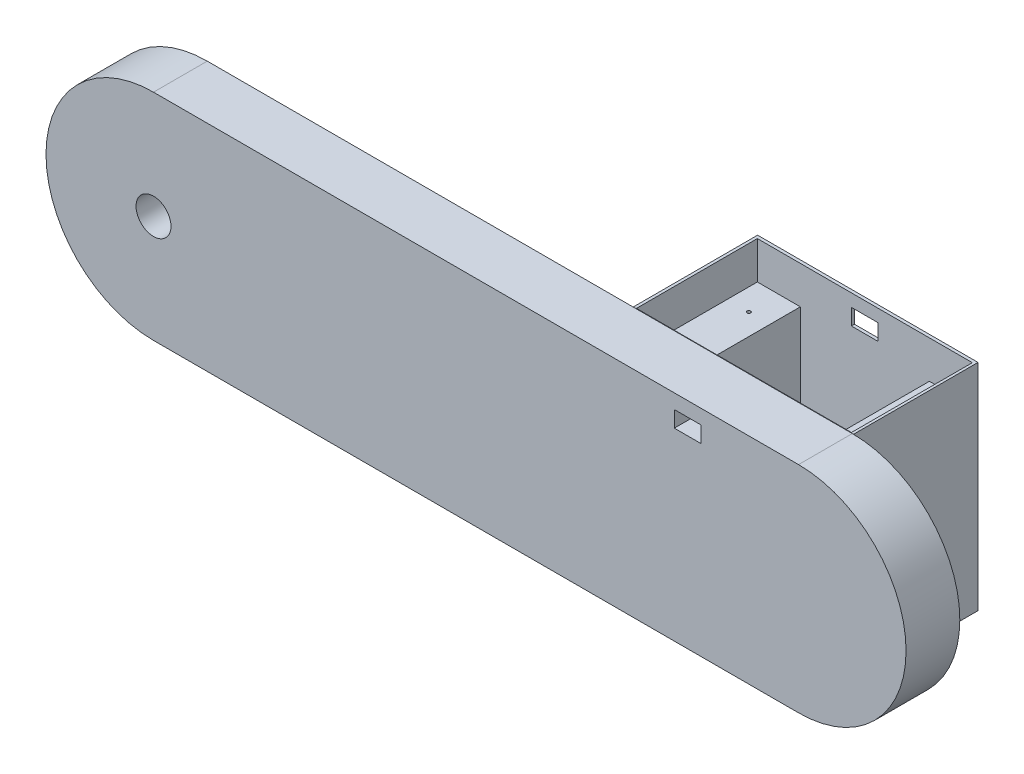
ISO-10303-21;
HEADER;
FILE_DESCRIPTION(('STEP AP214'),'2;1');
FILE_NAME('part.step','',(''),(''),'','','');
FILE_SCHEMA(('AUTOMOTIVE_DESIGN { 1 0 10303 214 1 1 1 1 }'));
ENDSEC;
DATA;
#1=APPLICATION_CONTEXT('core data for automotive mechanical design processes');
#2=APPLICATION_PROTOCOL_DEFINITION('international standard','automotive_design',2000,#1);
#3=PRODUCT_CONTEXT('',#1,'mechanical');
#4=PRODUCT('Part','Part','',(#3));
#5=PRODUCT_RELATED_PRODUCT_CATEGORY('part','',(#4));
#6=PRODUCT_DEFINITION_FORMATION('','',#4);
#7=PRODUCT_DEFINITION_CONTEXT('part definition',#1,'design');
#8=PRODUCT_DEFINITION('design','',#6,#7);
#9=PRODUCT_DEFINITION_SHAPE('','',#8);
#10=(LENGTH_UNIT() NAMED_UNIT(*) SI_UNIT(.MILLI.,.METRE.));
#11=(NAMED_UNIT(*) PLANE_ANGLE_UNIT() SI_UNIT($,.RADIAN.));
#12=(NAMED_UNIT(*) SI_UNIT($,.STERADIAN.) SOLID_ANGLE_UNIT());
#13=UNCERTAINTY_MEASURE_WITH_UNIT(LENGTH_MEASURE(1.E-05),#10,'distance_accuracy_value','');
#14=(GEOMETRIC_REPRESENTATION_CONTEXT(3) GLOBAL_UNCERTAINTY_ASSIGNED_CONTEXT((#13)) GLOBAL_UNIT_ASSIGNED_CONTEXT((#10,
#11,#12)) REPRESENTATION_CONTEXT('',''));
#15=CARTESIAN_POINT('',(0.,0.,0.));
#16=DIRECTION('',(0.,0.,1.));
#17=DIRECTION('',(1.,0.,0.));
#18=AXIS2_PLACEMENT_3D('',#15,#16,#17);
#19=CARTESIAN_POINT('',(9.4653166633379,-20.799662349746,-22.9318291217864));
#20=DIRECTION('',(0.,0.,-1.));
#21=DIRECTION('',(-1.,0.,0.));
#22=AXIS2_PLACEMENT_3D('',#19,#20,#21);
#23=PLANE('',#22);
#24=DIRECTION('',(-1.,0.,0.));
#25=VECTOR('',#24,1.);
#26=CARTESIAN_POINT('',(9.4653166633379,12.8589922089124,-22.9318291217864));
#27=LINE('',#26,#25);
#28=CARTESIAN_POINT('',(31.9407170008609,12.8589922089124,-22.9318291217864));
#29=VERTEX_POINT('',#28);
#30=CARTESIAN_POINT('',(26.9483388823597,12.8589922089124,-22.9318291217864));
#31=VERTEX_POINT('',#30);
#32=EDGE_CURVE('E261',#29,#31,#27,.T.);
#33=ORIENTED_EDGE('',*,*,#32,.T.);
#34=DIRECTION('',(0.,1.,0.));
#35=VECTOR('',#34,1.);
#36=CARTESIAN_POINT('',(26.9483388823597,-20.799662349746,-22.9318291217864));
#37=LINE('',#36,#35);
#38=CARTESIAN_POINT('',(26.9483388823597,15.8625567275374,-22.9318291217864));
#39=VERTEX_POINT('',#38);
#40=EDGE_CURVE('E269',#31,#39,#37,.T.);
#41=ORIENTED_EDGE('',*,*,#40,.T.);
#42=DIRECTION('',(1.,0.,0.));
#43=VECTOR('',#42,1.);
#44=CARTESIAN_POINT('',(9.4653166633379,15.8625567275374,-22.9318291217864));
#45=LINE('',#44,#43);
#46=CARTESIAN_POINT('',(31.9407170008609,15.8625567275374,-22.9318291217864));
#47=VERTEX_POINT('',#46);
#48=EDGE_CURVE('E247',#39,#47,#45,.T.);
#49=ORIENTED_EDGE('',*,*,#48,.T.);
#50=DIRECTION('',(0.,-1.,0.));
#51=VECTOR('',#50,1.);
#52=CARTESIAN_POINT('',(31.9407170008609,-20.799662349746,-22.9318291217864));
#53=LINE('',#52,#51);
#54=EDGE_CURVE('E213',#47,#29,#53,.T.);
#55=ORIENTED_EDGE('',*,*,#54,.T.);
#56=EDGE_LOOP('',(#33,#41,#49,#55));
#57=FACE_BOUND('',#56,.T.);
#58=DIRECTION('',(0.,-1.,0.));
#59=VECTOR('',#58,1.);
#60=CARTESIAN_POINT('',(17.4653166633379,11.200337650254,-22.9318291217864));
#61=LINE('',#60,#59);
#62=CARTESIAN_POINT('',(17.4653166633379,11.200337650254,-22.9318291217864));
#63=VERTEX_POINT('',#62);
#64=CARTESIAN_POINT('',(17.4653166633379,-20.799662349746,-22.9318291217864));
#65=VERTEX_POINT('',#64);
#66=EDGE_CURVE('E306',#63,#65,#61,.T.);
#67=ORIENTED_EDGE('',*,*,#66,.T.);
#68=DIRECTION('',(-1.,0.,0.));
#69=VECTOR('',#68,1.);
#70=CARTESIAN_POINT('',(9.4653166633379,-20.799662349746,-22.9318291217864));
#71=LINE('',#70,#69);
#72=CARTESIAN_POINT('',(41.4653166633379,-20.799662349746,-22.9318291217864));
#73=VERTEX_POINT('',#72);
#74=EDGE_CURVE('E330',#73,#65,#71,.T.);
#75=ORIENTED_EDGE('',*,*,#74,.F.);
#76=DIRECTION('',(0.,-1.,0.));
#77=VECTOR('',#76,1.);
#78=CARTESIAN_POINT('',(41.4653166633379,11.200337650254,-22.9318291217864));
#79=LINE('',#78,#77);
#80=CARTESIAN_POINT('',(41.4653166633379,11.200337650254,-22.9318291217864));
#81=VERTEX_POINT('',#80);
#82=EDGE_CURVE('E294',#81,#73,#79,.T.);
#83=ORIENTED_EDGE('',*,*,#82,.F.);
#84=DIRECTION('',(-1.,0.,0.));
#85=VECTOR('',#84,1.);
#86=CARTESIAN_POINT('',(49.4653166633379,11.200337650254,-22.9318291217864));
#87=LINE('',#86,#85);
#88=CARTESIAN_POINT('',(49.4653166633379,11.200337650254,-22.9318291217864));
#89=VERTEX_POINT('',#88);
#90=EDGE_CURVE('E324',#89,#81,#87,.T.);
#91=ORIENTED_EDGE('',*,*,#90,.F.);
#92=DIRECTION('',(0.,1.,0.));
#93=VECTOR('',#92,1.);
#94=CARTESIAN_POINT('',(49.4653166633379,-20.799662349746,-22.9318291217864));
#95=LINE('',#94,#93);
#96=CARTESIAN_POINT('',(49.4653166633379,18.200337650254,-22.9318291217864));
#97=VERTEX_POINT('',#96);
#98=EDGE_CURVE('E348',#89,#97,#95,.T.);
#99=ORIENTED_EDGE('',*,*,#98,.T.);
#100=DIRECTION('',(-1.,0.,0.));
#101=VECTOR('',#100,1.);
#102=CARTESIAN_POINT('',(9.4653166633379,18.200337650254,-22.9318291217864));
#103=LINE('',#102,#101);
#104=CARTESIAN_POINT('',(9.4653166633379,18.200337650254,-22.9318291217864));
#105=VERTEX_POINT('',#104);
#106=EDGE_CURVE('E331',#97,#105,#103,.T.);
#107=ORIENTED_EDGE('',*,*,#106,.T.);
#108=DIRECTION('',(0.,1.,0.));
#109=VECTOR('',#108,1.);
#110=CARTESIAN_POINT('',(9.4653166633379,-20.799662349746,-22.9318291217864));
#111=LINE('',#110,#109);
#112=CARTESIAN_POINT('',(9.4653166633379,11.200337650254,-22.9318291217864));
#113=VERTEX_POINT('',#112);
#114=EDGE_CURVE('E345',#113,#105,#111,.T.);
#115=ORIENTED_EDGE('',*,*,#114,.F.);
#116=DIRECTION('',(-1.,0.,0.));
#117=VECTOR('',#116,1.);
#118=CARTESIAN_POINT('',(9.4653166633379,11.200337650254,-22.9318291217864));
#119=LINE('',#118,#117);
#120=EDGE_CURVE('E304',#63,#113,#119,.T.);
#121=ORIENTED_EDGE('',*,*,#120,.F.);
#122=EDGE_LOOP('',(#67,#75,#83,#91,#99,#107,#115,#121));
#123=FACE_BOUND('',#122,.T.);
#124=ADVANCED_FACE('F39',(#57,#123),#23,.F.);
#125=CARTESIAN_POINT('',(49.4653166633379,-20.799662349746,-22.9318291217864));
#126=DIRECTION('',(1.,0.,0.));
#127=DIRECTION('',(0.,0.,-1.));
#128=AXIS2_PLACEMENT_3D('',#125,#126,#127);
#129=PLANE('',#128);
#130=DIRECTION('',(0.,0.,-1.));
#131=VECTOR('',#130,1.);
#132=CARTESIAN_POINT('',(49.4653166633379,11.200337650254,-22.9318291217864));
#133=LINE('',#132,#131);
#134=CARTESIAN_POINT('',(49.4653166633379,11.200337650254,-0.431829121786357));
#135=VERTEX_POINT('',#134);
#136=EDGE_CURVE('E320',#135,#89,#133,.T.);
#137=ORIENTED_EDGE('',*,*,#136,.F.);
#138=DIRECTION('',(0.,1.,0.));
#139=VECTOR('',#138,1.);
#140=CARTESIAN_POINT('',(49.4653166633379,-20.799662349746,-0.431829121786357));
#141=LINE('',#140,#139);
#142=CARTESIAN_POINT('',(49.4653166633379,18.200337650254,-0.431829121786357));
#143=VERTEX_POINT('',#142);
#144=EDGE_CURVE('E350',#135,#143,#141,.T.);
#145=ORIENTED_EDGE('',*,*,#144,.T.);
#146=DIRECTION('',(0.,0.,-1.));
#147=VECTOR('',#146,1.);
#148=CARTESIAN_POINT('',(49.4653166633379,18.200337650254,-22.9318291217864));
#149=LINE('',#148,#147);
#150=EDGE_CURVE('E340',#143,#97,#149,.T.);
#151=ORIENTED_EDGE('',*,*,#150,.T.);
#152=ORIENTED_EDGE('',*,*,#98,.F.);
#153=EDGE_LOOP('',(#137,#145,#151,#152));
#154=FACE_BOUND('',#153,.T.);
#155=ADVANCED_FACE('F476',(#154),#129,.F.);
#156=CARTESIAN_POINT('',(9.4653166633379,-20.799662349746,-0.431829121786357));
#157=DIRECTION('',(0.,0.,1.));
#158=DIRECTION('',(1.,0.,0.));
#159=AXIS2_PLACEMENT_3D('',#156,#157,#158);
#160=PLANE('',#159);
#161=DIRECTION('',(-1.,0.,0.));
#162=VECTOR('',#161,1.);
#163=CARTESIAN_POINT('',(9.4653166633379,15.8625567275374,-0.431829121786357));
#164=LINE('',#163,#162);
#165=CARTESIAN_POINT('',(31.9407170008609,15.8625567275374,-0.43182912178636));
#166=VERTEX_POINT('',#165);
#167=CARTESIAN_POINT('',(26.9483388823597,15.8625567275374,-0.431829121786357));
#168=VERTEX_POINT('',#167);
#169=EDGE_CURVE('E244',#166,#168,#164,.T.);
#170=ORIENTED_EDGE('',*,*,#169,.T.);
#171=DIRECTION('',(0.,-1.,0.));
#172=VECTOR('',#171,1.);
#173=CARTESIAN_POINT('',(26.9483388823597,-20.799662349746,-0.431829121786357));
#174=LINE('',#173,#172);
#175=CARTESIAN_POINT('',(26.9483388823597,12.8589922089124,-0.43182912178636));
#176=VERTEX_POINT('',#175);
#177=EDGE_CURVE('E266',#168,#176,#174,.T.);
#178=ORIENTED_EDGE('',*,*,#177,.T.);
#179=DIRECTION('',(1.,0.,0.));
#180=VECTOR('',#179,1.);
#181=CARTESIAN_POINT('',(9.4653166633379,12.8589922089124,-0.431829121786357));
#182=LINE('',#181,#180);
#183=CARTESIAN_POINT('',(31.9407170008609,12.8589922089124,-0.43182912178636));
#184=VERTEX_POINT('',#183);
#185=EDGE_CURVE('E258',#176,#184,#182,.T.);
#186=ORIENTED_EDGE('',*,*,#185,.T.);
#187=DIRECTION('',(0.,1.,0.));
#188=VECTOR('',#187,1.);
#189=CARTESIAN_POINT('',(31.9407170008609,-20.799662349746,-0.431829121786357));
#190=LINE('',#189,#188);
#191=EDGE_CURVE('E252',#184,#166,#190,.T.);
#192=ORIENTED_EDGE('',*,*,#191,.T.);
#193=EDGE_LOOP('',(#170,#178,#186,#192));
#194=FACE_BOUND('',#193,.T.);
#195=DIRECTION('',(0.,-1.,0.));
#196=VECTOR('',#195,1.);
#197=CARTESIAN_POINT('',(17.4653166633379,11.200337650254,-0.431829121786357));
#198=LINE('',#197,#196);
#199=CARTESIAN_POINT('',(17.4653166633379,11.200337650254,-0.431829121786357));
#200=VERTEX_POINT('',#199);
#201=CARTESIAN_POINT('',(17.4653166633379,-20.799662349746,-0.431829121786357));
#202=VERTEX_POINT('',#201);
#203=EDGE_CURVE('E311',#200,#202,#198,.T.);
#204=ORIENTED_EDGE('',*,*,#203,.F.);
#205=DIRECTION('',(1.,0.,0.));
#206=VECTOR('',#205,1.);
#207=CARTESIAN_POINT('',(9.4653166633379,11.200337650254,-0.431829121786357));
#208=LINE('',#207,#206);
#209=CARTESIAN_POINT('',(9.4653166633379,11.200337650254,-0.431829121786357));
#210=VERTEX_POINT('',#209);
#211=EDGE_CURVE('E299',#210,#200,#208,.T.);
#212=ORIENTED_EDGE('',*,*,#211,.F.);
#213=DIRECTION('',(0.,1.,0.));
#214=VECTOR('',#213,1.);
#215=CARTESIAN_POINT('',(9.4653166633379,-20.799662349746,-0.431829121786357));
#216=LINE('',#215,#214);
#217=CARTESIAN_POINT('',(9.46531666333791,18.200337650254,-0.431829121786357));
#218=VERTEX_POINT('',#217);
#219=EDGE_CURVE('E334',#210,#218,#216,.T.);
#220=ORIENTED_EDGE('',*,*,#219,.T.);
#221=DIRECTION('',(1.,0.,0.));
#222=VECTOR('',#221,1.);
#223=CARTESIAN_POINT('',(9.4653166633379,18.200337650254,-0.431829121786357));
#224=LINE('',#223,#222);
#225=EDGE_CURVE('E337',#218,#143,#224,.T.);
#226=ORIENTED_EDGE('',*,*,#225,.T.);
#227=ORIENTED_EDGE('',*,*,#144,.F.);
#228=DIRECTION('',(1.,0.,0.));
#229=VECTOR('',#228,1.);
#230=CARTESIAN_POINT('',(49.4653166633379,11.200337650254,-0.431829121786357));
#231=LINE('',#230,#229);
#232=CARTESIAN_POINT('',(41.4653166633379,11.200337650254,-0.431829121786357));
#233=VERTEX_POINT('',#232);
#234=EDGE_CURVE('E318',#233,#135,#231,.T.);
#235=ORIENTED_EDGE('',*,*,#234,.F.);
#236=DIRECTION('',(0.,-1.,0.));
#237=VECTOR('',#236,1.);
#238=CARTESIAN_POINT('',(41.4653166633379,11.200337650254,-0.431829121786357));
#239=LINE('',#238,#237);
#240=CARTESIAN_POINT('',(41.4653166633379,-20.799662349746,-0.431829121786357));
#241=VERTEX_POINT('',#240);
#242=EDGE_CURVE('E315',#233,#241,#239,.T.);
#243=ORIENTED_EDGE('',*,*,#242,.T.);
#244=DIRECTION('',(1.,0.,0.));
#245=VECTOR('',#244,1.);
#246=CARTESIAN_POINT('',(9.4653166633379,-20.799662349746,-0.431829121786357));
#247=LINE('',#246,#245);
#248=EDGE_CURVE('E327',#202,#241,#247,.T.);
#249=ORIENTED_EDGE('',*,*,#248,.F.);
#250=EDGE_LOOP('',(#204,#212,#220,#226,#227,#235,#243,#249));
#251=FACE_BOUND('',#250,.T.);
#252=ADVANCED_FACE('F483',(#194,#251),#160,.F.);
#253=CARTESIAN_POINT('',(0.,-20.799662349746,0.));
#254=DIRECTION('',(0.,1.,0.));
#255=DIRECTION('',(0.,0.,1.));
#256=AXIS2_PLACEMENT_3D('',#253,#254,#255);
#257=PLANE('',#256);
#258=ORIENTED_EDGE('',*,*,#74,.T.);
#259=DIRECTION('',(0.,0.,-1.));
#260=VECTOR('',#259,1.);
#261=CARTESIAN_POINT('',(17.4653166633379,-20.799662349746,-22.9318291217864));
#262=LINE('',#261,#260);
#263=EDGE_CURVE('E300',#202,#65,#262,.T.);
#264=ORIENTED_EDGE('',*,*,#263,.F.);
#265=ORIENTED_EDGE('',*,*,#248,.T.);
#266=DIRECTION('',(0.,0.,1.));
#267=VECTOR('',#266,1.);
#268=CARTESIAN_POINT('',(41.4653166633379,-20.799662349746,-22.9318291217864));
#269=LINE('',#268,#267);
#270=EDGE_CURVE('E308',#73,#241,#269,.T.);
#271=ORIENTED_EDGE('',*,*,#270,.F.);
#272=EDGE_LOOP('',(#258,#264,#265,#271));
#273=FACE_BOUND('',#272,.T.);
#274=ADVANCED_FACE('F488',(#273),#257,.T.);
#275=CARTESIAN_POINT('',(-69.9374445717152,-1.45408844849987,0.));
#276=DIRECTION('',(0.,0.,1.));
#277=DIRECTION('',(1.,0.,0.));
#278=AXIS2_PLACEMENT_3D('',#275,#276,#277);
#279=PLANE('',#278);
#280=DIRECTION('',(0.,-1.,0.));
#281=VECTOR('',#280,1.);
#282=CARTESIAN_POINT('',(49.9445279416103,18.200337650254,0.));
#283=LINE('',#282,#281);
#284=CARTESIAN_POINT('',(49.9445279416103,18.200337650254,0.));
#285=VERTEX_POINT('',#284);
#286=CARTESIAN_POINT('',(49.9445279416103,-21.4540884484999,0.));
#287=VERTEX_POINT('',#286);
#288=EDGE_CURVE('E364',#285,#287,#283,.T.);
#289=ORIENTED_EDGE('',*,*,#288,.F.);
#290=DIRECTION('',(1.,0.,0.));
#291=VECTOR('',#290,1.);
#292=CARTESIAN_POINT('',(49.9445279416103,18.200337650254,0.));
#293=LINE('',#292,#291);
#294=CARTESIAN_POINT('',(8.9445279416103,18.200337650254,0.));
#295=VERTEX_POINT('',#294);
#296=EDGE_CURVE('E357',#295,#285,#293,.T.);
#297=ORIENTED_EDGE('',*,*,#296,.F.);
#298=DIRECTION('',(0.,1.,0.));
#299=VECTOR('',#298,1.);
#300=CARTESIAN_POINT('',(8.9445279416103,18.200337650254,0.));
#301=LINE('',#300,#299);
#302=CARTESIAN_POINT('',(8.9445279416103,-21.4540884484999,0.));
#303=VERTEX_POINT('',#302);
#304=EDGE_CURVE('E11',#303,#295,#301,.T.);
#305=ORIENTED_EDGE('',*,*,#304,.F.);
#306=DIRECTION('',(1.,0.,0.));
#307=VECTOR('',#306,1.);
#308=CARTESIAN_POINT('',(-69.9374445717152,-21.4540884484999,0.));
#309=LINE('',#308,#307);
#310=CARTESIAN_POINT('',(-69.9374445717152,-21.4540884484999,0.));
#311=VERTEX_POINT('',#310);
#312=EDGE_CURVE('E404',#311,#303,#309,.T.);
#313=ORIENTED_EDGE('',*,*,#312,.F.);
#314=CARTESIAN_POINT('',(-69.9374445717152,-1.45408844849987,0.));
#315=DIRECTION('',(0.,0.,1.));
#316=DIRECTION('',(1.,0.,0.));
#317=AXIS2_PLACEMENT_3D('',#314,#315,#316);
#318=CIRCLE('',#317,20.);
#319=CARTESIAN_POINT('',(-69.9374445717152,18.5459115515001,0.));
#320=VERTEX_POINT('',#319);
#321=EDGE_CURVE('E387',#320,#311,#318,.T.);
#322=ORIENTED_EDGE('',*,*,#321,.F.);
#323=DIRECTION('',(-1.,0.,0.));
#324=VECTOR('',#323,1.);
#325=CARTESIAN_POINT('',(-69.9374445717152,18.5459115515001,0.));
#326=LINE('',#325,#324);
#327=CARTESIAN_POINT('',(50.0625554282848,18.5459115515001,0.));
#328=VERTEX_POINT('',#327);
#329=EDGE_CURVE('E394',#328,#320,#326,.T.);
#330=ORIENTED_EDGE('',*,*,#329,.F.);
#331=CARTESIAN_POINT('',(50.0625554282848,-1.45408844849987,0.));
#332=DIRECTION('',(0.,0.,1.));
#333=DIRECTION('',(1.,0.,0.));
#334=AXIS2_PLACEMENT_3D('',#331,#332,#333);
#335=CIRCLE('',#334,20.);
#336=CARTESIAN_POINT('',(50.0625554282848,-21.4540884484999,0.));
#337=VERTEX_POINT('',#336);
#338=EDGE_CURVE('E407',#337,#328,#335,.T.);
#339=ORIENTED_EDGE('',*,*,#338,.F.);
#340=EDGE_CURVE('E403',#287,#337,#309,.T.);
#341=ORIENTED_EDGE('',*,*,#340,.F.);
#342=EDGE_LOOP('',(#289,#297,#305,#313,#322,#330,#339,#341));
#343=FACE_BOUND('',#342,.T.);
#344=ADVANCED_FACE('F433',(#343),#279,.F.);
#345=CARTESIAN_POINT('',(-69.9374445717152,-1.45408844849987,10.));
#346=DIRECTION('',(0.,0.,-1.));
#347=DIRECTION('',(-1.,0.,0.));
#348=AXIS2_PLACEMENT_3D('',#345,#346,#347);
#349=CYLINDRICAL_SURFACE('',#348,20.);
#350=ORIENTED_EDGE('',*,*,#321,.T.);
#351=DIRECTION('',(0.,0.,-1.));
#352=VECTOR('',#351,1.);
#353=CARTESIAN_POINT('',(-69.9374445717152,-21.4540884484999,10.));
#354=LINE('',#353,#352);
#355=CARTESIAN_POINT('',(-69.9374445717152,-21.4540884484999,10.));
#356=VERTEX_POINT('',#355);
#357=EDGE_CURVE('E43',#356,#311,#354,.T.);
#358=ORIENTED_EDGE('',*,*,#357,.F.);
#359=CARTESIAN_POINT('',(-69.9374445717152,-1.45408844849987,10.));
#360=DIRECTION('',(0.,0.,1.));
#361=DIRECTION('',(1.,0.,0.));
#362=AXIS2_PLACEMENT_3D('',#359,#360,#361);
#363=CIRCLE('',#362,20.);
#364=CARTESIAN_POINT('',(-69.9374445717152,18.5459115515001,10.));
#365=VERTEX_POINT('',#364);
#366=EDGE_CURVE('E390',#365,#356,#363,.T.);
#367=ORIENTED_EDGE('',*,*,#366,.F.);
#368=DIRECTION('',(0.,0.,-1.));
#369=VECTOR('',#368,1.);
#370=CARTESIAN_POINT('',(-69.9374445717152,18.5459115515001,10.));
#371=LINE('',#370,#369);
#372=EDGE_CURVE('E400',#365,#320,#371,.T.);
#373=ORIENTED_EDGE('',*,*,#372,.T.);
#374=EDGE_LOOP('',(#350,#358,#367,#373));
#375=FACE_BOUND('',#374,.T.);
#376=ADVANCED_FACE('F41',(#375),#349,.T.);
#377=CARTESIAN_POINT('',(-69.9374445717152,-21.4540884484999,10.));
#378=DIRECTION('',(0.,1.,0.));
#379=DIRECTION('',(0.,0.,1.));
#380=AXIS2_PLACEMENT_3D('',#377,#378,#379);
#381=PLANE('',#380);
#382=ORIENTED_EDGE('',*,*,#312,.T.);
#383=EDGE_CURVE('E408',#303,#287,#309,.T.);
#384=ORIENTED_EDGE('',*,*,#383,.T.);
#385=ORIENTED_EDGE('',*,*,#340,.T.);
#386=DIRECTION('',(0.,0.,-1.));
#387=VECTOR('',#386,1.);
#388=CARTESIAN_POINT('',(50.0625554282848,-21.4540884484999,10.));
#389=LINE('',#388,#387);
#390=CARTESIAN_POINT('',(50.0625554282848,-21.4540884484999,10.));
#391=VERTEX_POINT('',#390);
#392=EDGE_CURVE('E415',#391,#337,#389,.T.);
#393=ORIENTED_EDGE('',*,*,#392,.F.);
#394=DIRECTION('',(1.,0.,0.));
#395=VECTOR('',#394,1.);
#396=CARTESIAN_POINT('',(-69.9374445717152,-21.4540884484999,10.));
#397=LINE('',#396,#395);
#398=EDGE_CURVE('E393',#356,#391,#397,.T.);
#399=ORIENTED_EDGE('',*,*,#398,.F.);
#400=ORIENTED_EDGE('',*,*,#357,.T.);
#401=EDGE_LOOP('',(#382,#384,#385,#393,#399,#400));
#402=FACE_BOUND('',#401,.T.);
#403=ADVANCED_FACE('F424',(#402),#381,.F.);
#404=CARTESIAN_POINT('',(50.0625554282848,-1.45408844849987,10.));
#405=DIRECTION('',(0.,0.,-1.));
#406=DIRECTION('',(-1.,0.,0.));
#407=AXIS2_PLACEMENT_3D('',#404,#405,#406);
#408=CYLINDRICAL_SURFACE('',#407,20.);
#409=ORIENTED_EDGE('',*,*,#338,.T.);
#410=DIRECTION('',(0.,0.,-1.));
#411=VECTOR('',#410,1.);
#412=CARTESIAN_POINT('',(50.0625554282848,18.5459115515001,10.));
#413=LINE('',#412,#411);
#414=CARTESIAN_POINT('',(50.0625554282848,18.5459115515001,10.));
#415=VERTEX_POINT('',#414);
#416=EDGE_CURVE('E413',#415,#328,#413,.T.);
#417=ORIENTED_EDGE('',*,*,#416,.F.);
#418=CARTESIAN_POINT('',(50.0625554282848,-1.45408844849987,10.));
#419=DIRECTION('',(0.,0.,1.));
#420=DIRECTION('',(1.,0.,0.));
#421=AXIS2_PLACEMENT_3D('',#418,#419,#420);
#422=CIRCLE('',#421,20.);
#423=EDGE_CURVE('E396',#391,#415,#422,.T.);
#424=ORIENTED_EDGE('',*,*,#423,.F.);
#425=ORIENTED_EDGE('',*,*,#392,.T.);
#426=EDGE_LOOP('',(#409,#417,#424,#425));
#427=FACE_BOUND('',#426,.T.);
#428=ADVANCED_FACE('F452',(#427),#408,.T.);
#429=CARTESIAN_POINT('',(-69.9374445717152,18.5459115515001,10.));
#430=DIRECTION('',(0.,-1.,0.));
#431=DIRECTION('',(0.,0.,-1.));
#432=AXIS2_PLACEMENT_3D('',#429,#430,#431);
#433=PLANE('',#432);
#434=ORIENTED_EDGE('',*,*,#329,.T.);
#435=ORIENTED_EDGE('',*,*,#372,.F.);
#436=DIRECTION('',(-1.,0.,0.));
#437=VECTOR('',#436,1.);
#438=CARTESIAN_POINT('',(-69.9374445717152,18.5459115515001,10.));
#439=LINE('',#438,#437);
#440=EDGE_CURVE('E398',#415,#365,#439,.T.);
#441=ORIENTED_EDGE('',*,*,#440,.F.);
#442=ORIENTED_EDGE('',*,*,#416,.T.);
#443=EDGE_LOOP('',(#434,#435,#441,#442));
#444=FACE_BOUND('',#443,.T.);
#445=ADVANCED_FACE('F455',(#444),#433,.F.);
#446=CARTESIAN_POINT('',(-69.9374445717152,-1.45408844849987,10.));
#447=DIRECTION('',(0.,0.,1.));
#448=DIRECTION('',(1.,0.,0.));
#449=AXIS2_PLACEMENT_3D('',#446,#447,#448);
#450=PLANE('',#449);
#451=DIRECTION('',(0.,-1.,0.));
#452=VECTOR('',#451,1.);
#453=CARTESIAN_POINT('',(26.9483388823596,-1.45408844849987,10.));
#454=LINE('',#453,#452);
#455=CARTESIAN_POINT('',(26.9483388823597,15.8625567275374,10.));
#456=VERTEX_POINT('',#455);
#457=CARTESIAN_POINT('',(26.9483388823597,12.8589922089124,10.));
#458=VERTEX_POINT('',#457);
#459=EDGE_CURVE('E264',#456,#458,#454,.T.);
#460=ORIENTED_EDGE('',*,*,#459,.F.);
#461=DIRECTION('',(-1.,0.,0.));
#462=VECTOR('',#461,1.);
#463=CARTESIAN_POINT('',(-69.9374445717152,15.8625567275374,10.));
#464=LINE('',#463,#462);
#465=CARTESIAN_POINT('',(31.9407170008609,15.8625567275374,10.));
#466=VERTEX_POINT('',#465);
#467=EDGE_CURVE('E242',#466,#456,#464,.T.);
#468=ORIENTED_EDGE('',*,*,#467,.F.);
#469=DIRECTION('',(0.,1.,0.));
#470=VECTOR('',#469,1.);
#471=CARTESIAN_POINT('',(31.9407170008609,-1.45408844849987,10.));
#472=LINE('',#471,#470);
#473=CARTESIAN_POINT('',(31.9407170008609,12.8589922089124,10.));
#474=VERTEX_POINT('',#473);
#475=EDGE_CURVE('E249',#474,#466,#472,.T.);
#476=ORIENTED_EDGE('',*,*,#475,.F.);
#477=DIRECTION('',(1.,0.,0.));
#478=VECTOR('',#477,1.);
#479=CARTESIAN_POINT('',(-69.9374445717152,12.8589922089124,10.));
#480=LINE('',#479,#478);
#481=EDGE_CURVE('E256',#458,#474,#480,.T.);
#482=ORIENTED_EDGE('',*,*,#481,.F.);
#483=EDGE_LOOP('',(#460,#468,#476,#482));
#484=FACE_BOUND('',#483,.T.);
#485=CARTESIAN_POINT('',(-69.9374445717152,-1.45408844849987,10.));
#486=DIRECTION('',(0.,0.,1.));
#487=DIRECTION('',(1.,0.,0.));
#488=AXIS2_PLACEMENT_3D('',#485,#486,#487);
#489=CIRCLE('',#488,3.25000000000001);
#490=CARTESIAN_POINT('',(-66.6874445717152,-1.45408844849987,10.));
#491=VERTEX_POINT('',#490);
#492=EDGE_CURVE('E383',#491,#491,#489,.T.);
#493=ORIENTED_EDGE('',*,*,#492,.F.);
#494=EDGE_LOOP('',(#493));
#495=FACE_BOUND('',#494,.T.);
#496=ORIENTED_EDGE('',*,*,#366,.T.);
#497=ORIENTED_EDGE('',*,*,#398,.T.);
#498=ORIENTED_EDGE('',*,*,#423,.T.);
#499=ORIENTED_EDGE('',*,*,#440,.T.);
#500=EDGE_LOOP('',(#496,#497,#498,#499));
#501=FACE_BOUND('',#500,.T.);
#502=ADVANCED_FACE('F457',(#484,#495,#501),#450,.T.);
#503=CARTESIAN_POINT('',(-69.9374445717152,-1.45408844849987,4.));
#504=DIRECTION('',(0.,0.,1.));
#505=DIRECTION('',(1.,0.,0.));
#506=AXIS2_PLACEMENT_3D('',#503,#504,#505);
#507=CYLINDRICAL_SURFACE('',#506,3.25000000000001);
#508=CARTESIAN_POINT('',(-69.9374445717152,-1.45408844849987,4.));
#509=DIRECTION('',(0.,0.,1.));
#510=DIRECTION('',(1.,0.,0.));
#511=AXIS2_PLACEMENT_3D('',#508,#509,#510);
#512=CIRCLE('',#511,3.25000000000001);
#513=CARTESIAN_POINT('',(-66.6874445717152,-1.45408844849987,4.));
#514=VERTEX_POINT('',#513);
#515=EDGE_CURVE('E384',#514,#514,#512,.T.);
#516=ORIENTED_EDGE('',*,*,#515,.F.);
#517=EDGE_LOOP('',(#516));
#518=FACE_BOUND('',#517,.T.);
#519=ORIENTED_EDGE('',*,*,#492,.T.);
#520=EDGE_LOOP('',(#519));
#521=FACE_BOUND('',#520,.T.);
#522=ADVANCED_FACE('F459',(#518,#521),#507,.F.);
#523=CARTESIAN_POINT('',(-69.9374445717152,-1.45408844849987,4.));
#524=DIRECTION('',(0.,0.,1.));
#525=DIRECTION('',(1.,0.,0.));
#526=AXIS2_PLACEMENT_3D('',#523,#524,#525);
#527=PLANE('',#526);
#528=ORIENTED_EDGE('',*,*,#515,.T.);
#529=EDGE_LOOP('',(#528));
#530=FACE_BOUND('',#529,.T.);
#531=ADVANCED_FACE('F467',(#530),#527,.T.);
#532=CARTESIAN_POINT('',(49.9445279416103,18.200337650254,-23.5));
#533=DIRECTION('',(-1.,0.,0.));
#534=DIRECTION('',(0.,-1.,0.));
#535=AXIS2_PLACEMENT_3D('',#532,#533,#534);
#536=PLANE('',#535);
#537=ORIENTED_EDGE('',*,*,#288,.T.);
#538=CARTESIAN_POINT('',(49.9445279416103,-21.799662349746,0.));
#539=VERTEX_POINT('',#538);
#540=EDGE_CURVE('E347',#287,#539,#283,.T.);
#541=ORIENTED_EDGE('',*,*,#540,.T.);
#542=DIRECTION('',(0.,0.,1.));
#543=VECTOR('',#542,1.);
#544=CARTESIAN_POINT('',(49.9445279416103,-21.799662349746,-23.5));
#545=LINE('',#544,#543);
#546=CARTESIAN_POINT('',(49.9445279416103,-21.799662349746,-23.5));
#547=VERTEX_POINT('',#546);
#548=EDGE_CURVE('E380',#547,#539,#545,.T.);
#549=ORIENTED_EDGE('',*,*,#548,.F.);
#550=DIRECTION('',(0.,-1.,0.));
#551=VECTOR('',#550,1.);
#552=CARTESIAN_POINT('',(49.9445279416103,18.200337650254,-23.5));
#553=LINE('',#552,#551);
#554=CARTESIAN_POINT('',(49.9445279416103,18.200337650254,-23.5));
#555=VERTEX_POINT('',#554);
#556=EDGE_CURVE('E353',#555,#547,#553,.T.);
#557=ORIENTED_EDGE('',*,*,#556,.F.);
#558=DIRECTION('',(0.,0.,1.));
#559=VECTOR('',#558,1.);
#560=CARTESIAN_POINT('',(49.9445279416103,18.200337650254,-23.5));
#561=LINE('',#560,#559);
#562=EDGE_CURVE('E363',#555,#285,#561,.T.);
#563=ORIENTED_EDGE('',*,*,#562,.T.);
#564=EDGE_LOOP('',(#537,#541,#549,#557,#563));
#565=FACE_BOUND('',#564,.T.);
#566=ADVANCED_FACE('F509',(#565),#536,.F.);
#567=CARTESIAN_POINT('',(49.9445279416103,-21.799662349746,-23.5));
#568=DIRECTION('',(0.,1.,0.));
#569=DIRECTION('',(0.,0.,1.));
#570=AXIS2_PLACEMENT_3D('',#567,#568,#569);
#571=PLANE('',#570);
#572=DIRECTION('',(-1.,0.,0.));
#573=VECTOR('',#572,1.);
#574=CARTESIAN_POINT('',(49.9445279416103,-21.799662349746,0.));
#575=LINE('',#574,#573);
#576=CARTESIAN_POINT('',(8.94452794161029,-21.799662349746,0.));
#577=VERTEX_POINT('',#576);
#578=EDGE_CURVE('E367',#539,#577,#575,.T.);
#579=ORIENTED_EDGE('',*,*,#578,.T.);
#580=DIRECTION('',(0.,0.,1.));
#581=VECTOR('',#580,1.);
#582=CARTESIAN_POINT('',(8.94452794161029,-21.799662349746,-23.5));
#583=LINE('',#582,#581);
#584=CARTESIAN_POINT('',(8.94452794161029,-21.799662349746,-23.5));
#585=VERTEX_POINT('',#584);
#586=EDGE_CURVE('E377',#585,#577,#583,.T.);
#587=ORIENTED_EDGE('',*,*,#586,.F.);
#588=DIRECTION('',(-1.,0.,0.));
#589=VECTOR('',#588,1.);
#590=CARTESIAN_POINT('',(49.9445279416103,-21.799662349746,-23.5));
#591=LINE('',#590,#589);
#592=EDGE_CURVE('E356',#547,#585,#591,.T.);
#593=ORIENTED_EDGE('',*,*,#592,.F.);
#594=ORIENTED_EDGE('',*,*,#548,.T.);
#595=EDGE_LOOP('',(#579,#587,#593,#594));
#596=FACE_BOUND('',#595,.T.);
#597=ADVANCED_FACE('F506',(#596),#571,.F.);
#598=CARTESIAN_POINT('',(8.9445279416103,18.200337650254,-23.5));
#599=DIRECTION('',(1.,0.,0.));
#600=DIRECTION('',(0.,1.,0.));
#601=AXIS2_PLACEMENT_3D('',#598,#599,#600);
#602=PLANE('',#601);
#603=EDGE_CURVE('E49',#577,#303,#301,.T.);
#604=ORIENTED_EDGE('',*,*,#603,.T.);
#605=ORIENTED_EDGE('',*,*,#304,.T.);
#606=DIRECTION('',(0.,0.,1.));
#607=VECTOR('',#606,1.);
#608=CARTESIAN_POINT('',(8.9445279416103,18.200337650254,-23.5));
#609=LINE('',#608,#607);
#610=CARTESIAN_POINT('',(8.9445279416103,18.200337650254,-23.5));
#611=VERTEX_POINT('',#610);
#612=EDGE_CURVE('E374',#611,#295,#609,.T.);
#613=ORIENTED_EDGE('',*,*,#612,.F.);
#614=DIRECTION('',(0.,1.,0.));
#615=VECTOR('',#614,1.);
#616=CARTESIAN_POINT('',(8.9445279416103,18.200337650254,-23.5));
#617=LINE('',#616,#615);
#618=EDGE_CURVE('E359',#585,#611,#617,.T.);
#619=ORIENTED_EDGE('',*,*,#618,.F.);
#620=ORIENTED_EDGE('',*,*,#586,.T.);
#621=EDGE_LOOP('',(#604,#605,#613,#619,#620));
#622=FACE_BOUND('',#621,.T.);
#623=ADVANCED_FACE('F436',(#622),#602,.F.);
#624=CARTESIAN_POINT('',(49.9445279416103,18.200337650254,-23.5));
#625=DIRECTION('',(0.,-1.,0.));
#626=DIRECTION('',(0.,0.,-1.));
#627=AXIS2_PLACEMENT_3D('',#624,#625,#626);
#628=PLANE('',#627);
#629=ORIENTED_EDGE('',*,*,#225,.F.);
#630=DIRECTION('',(0.,0.,1.));
#631=VECTOR('',#630,1.);
#632=CARTESIAN_POINT('',(9.4653166633379,18.200337650254,-22.9318291217864));
#633=LINE('',#632,#631);
#634=EDGE_CURVE('E313',#105,#218,#633,.T.);
#635=ORIENTED_EDGE('',*,*,#634,.F.);
#636=ORIENTED_EDGE('',*,*,#106,.F.);
#637=ORIENTED_EDGE('',*,*,#150,.F.);
#638=EDGE_LOOP('',(#629,#635,#636,#637));
#639=FACE_BOUND('',#638,.T.);
#640=ORIENTED_EDGE('',*,*,#296,.T.);
#641=ORIENTED_EDGE('',*,*,#562,.F.);
#642=DIRECTION('',(1.,0.,0.));
#643=VECTOR('',#642,1.);
#644=CARTESIAN_POINT('',(49.9445279416103,18.200337650254,-23.5));
#645=LINE('',#644,#643);
#646=EDGE_CURVE('E361',#611,#555,#645,.T.);
#647=ORIENTED_EDGE('',*,*,#646,.F.);
#648=ORIENTED_EDGE('',*,*,#612,.T.);
#649=EDGE_LOOP('',(#640,#641,#647,#648));
#650=FACE_BOUND('',#649,.T.);
#651=ADVANCED_FACE('F441',(#639,#650),#628,.F.);
#652=CARTESIAN_POINT('',(0.,0.,-23.5));
#653=DIRECTION('',(0.,0.,-1.));
#654=DIRECTION('',(-1.,0.,0.));
#655=AXIS2_PLACEMENT_3D('',#652,#653,#654);
#656=PLANE('',#655);
#657=DIRECTION('',(0.,1.,0.));
#658=VECTOR('',#657,1.);
#659=CARTESIAN_POINT('',(26.9483388823597,15.8625567275374,-23.5));
#660=LINE('',#659,#658);
#661=CARTESIAN_POINT('',(26.9483388823597,12.8589922089124,-23.5));
#662=VERTEX_POINT('',#661);
#663=CARTESIAN_POINT('',(26.9483388823597,15.8625567275374,-23.5));
#664=VERTEX_POINT('',#663);
#665=EDGE_CURVE('E225',#662,#664,#660,.T.);
#666=ORIENTED_EDGE('',*,*,#665,.F.);
#667=DIRECTION('',(-1.,0.,0.));
#668=VECTOR('',#667,1.);
#669=CARTESIAN_POINT('',(31.9407170008609,12.8589922089124,-23.5));
#670=LINE('',#669,#668);
#671=CARTESIAN_POINT('',(31.9407170008609,12.8589922089124,-23.5));
#672=VERTEX_POINT('',#671);
#673=EDGE_CURVE('E230',#672,#662,#670,.T.);
#674=ORIENTED_EDGE('',*,*,#673,.F.);
#675=DIRECTION('',(0.,-1.,0.));
#676=VECTOR('',#675,1.);
#677=CARTESIAN_POINT('',(31.9407170008609,15.8625567275374,-23.5));
#678=LINE('',#677,#676);
#679=CARTESIAN_POINT('',(31.9407170008609,15.8625567275374,-23.5));
#680=VERTEX_POINT('',#679);
#681=EDGE_CURVE('E210',#680,#672,#678,.T.);
#682=ORIENTED_EDGE('',*,*,#681,.F.);
#683=DIRECTION('',(1.,0.,0.));
#684=VECTOR('',#683,1.);
#685=CARTESIAN_POINT('',(31.9407170008609,15.8625567275374,-23.5));
#686=LINE('',#685,#684);
#687=EDGE_CURVE('E219',#664,#680,#686,.T.);
#688=ORIENTED_EDGE('',*,*,#687,.F.);
#689=EDGE_LOOP('',(#666,#674,#682,#688));
#690=FACE_BOUND('',#689,.T.);
#691=ORIENTED_EDGE('',*,*,#556,.T.);
#692=ORIENTED_EDGE('',*,*,#592,.T.);
#693=ORIENTED_EDGE('',*,*,#618,.T.);
#694=ORIENTED_EDGE('',*,*,#646,.T.);
#695=EDGE_LOOP('',(#691,#692,#693,#694));
#696=FACE_BOUND('',#695,.T.);
#697=ADVANCED_FACE('F227',(#690,#696),#656,.T.);
#698=CARTESIAN_POINT('',(0.,0.,0.));
#699=DIRECTION('',(0.,0.,-1.));
#700=DIRECTION('',(-1.,0.,0.));
#701=AXIS2_PLACEMENT_3D('',#698,#699,#700);
#702=PLANE('',#701);
#703=ORIENTED_EDGE('',*,*,#383,.F.);
#704=ORIENTED_EDGE('',*,*,#603,.F.);
#705=ORIENTED_EDGE('',*,*,#578,.F.);
#706=ORIENTED_EDGE('',*,*,#540,.F.);
#707=EDGE_LOOP('',(#703,#704,#705,#706));
#708=FACE_BOUND('',#707,.T.);
#709=ADVANCED_FACE('F449',(#708),#702,.F.);
#710=CARTESIAN_POINT('',(9.4653166633379,-20.799662349746,-22.9318291217864));
#711=DIRECTION('',(-1.,0.,0.));
#712=DIRECTION('',(0.,0.,1.));
#713=AXIS2_PLACEMENT_3D('',#710,#711,#712);
#714=PLANE('',#713);
#715=ORIENTED_EDGE('',*,*,#219,.F.);
#716=DIRECTION('',(0.,0.,1.));
#717=VECTOR('',#716,1.);
#718=CARTESIAN_POINT('',(9.4653166633379,11.200337650254,-22.9318291217864));
#719=LINE('',#718,#717);
#720=EDGE_CURVE('E297',#113,#210,#719,.T.);
#721=ORIENTED_EDGE('',*,*,#720,.F.);
#722=ORIENTED_EDGE('',*,*,#114,.T.);
#723=ORIENTED_EDGE('',*,*,#634,.T.);
#724=EDGE_LOOP('',(#715,#721,#722,#723));
#725=FACE_BOUND('',#724,.T.);
#726=ADVANCED_FACE('F493',(#725),#714,.F.);
#727=CARTESIAN_POINT('',(41.4653166633379,11.200337650254,-22.9318291217864));
#728=DIRECTION('',(1.,0.,0.));
#729=DIRECTION('',(0.,0.,-1.));
#730=AXIS2_PLACEMENT_3D('',#727,#728,#729);
#731=PLANE('',#730);
#732=ORIENTED_EDGE('',*,*,#270,.T.);
#733=ORIENTED_EDGE('',*,*,#242,.F.);
#734=DIRECTION('',(0.,0.,1.));
#735=VECTOR('',#734,1.);
#736=CARTESIAN_POINT('',(41.4653166633379,11.200337650254,-22.9318291217864));
#737=LINE('',#736,#735);
#738=EDGE_CURVE('E322',#81,#233,#737,.T.);
#739=ORIENTED_EDGE('',*,*,#738,.F.);
#740=ORIENTED_EDGE('',*,*,#82,.T.);
#741=EDGE_LOOP('',(#732,#733,#739,#740));
#742=FACE_BOUND('',#741,.T.);
#743=ADVANCED_FACE('F496',(#742),#731,.F.);
#744=CARTESIAN_POINT('',(0.,11.200337650254,0.));
#745=DIRECTION('',(0.,-1.,0.));
#746=DIRECTION('',(0.,0.,-1.));
#747=AXIS2_PLACEMENT_3D('',#744,#745,#746);
#748=PLANE('',#747);
#749=CARTESIAN_POINT('',(45.4880629906913,11.200337650254,-6.05682912178636));
#750=DIRECTION('',(0.,1.,0.));
#751=DIRECTION('',(0.,0.,1.));
#752=AXIS2_PLACEMENT_3D('',#749,#750,#751);
#753=CIRCLE('',#752,0.325000000000002);
#754=CARTESIAN_POINT('',(45.4880629906913,11.200337650254,-5.73182912178636));
#755=VERTEX_POINT('',#754);
#756=EDGE_CURVE('E279',#755,#755,#753,.T.);
#757=ORIENTED_EDGE('',*,*,#756,.F.);
#758=EDGE_LOOP('',(#757));
#759=FACE_BOUND('',#758,.T.);
#760=CARTESIAN_POINT('',(45.4880629906913,11.200337650254,-17.3068291217864));
#761=DIRECTION('',(0.,1.,0.));
#762=DIRECTION('',(0.,0.,1.));
#763=AXIS2_PLACEMENT_3D('',#760,#761,#762);
#764=CIRCLE('',#763,0.325000000000002);
#765=CARTESIAN_POINT('',(45.4880629906913,11.200337650254,-16.9818291217864));
#766=VERTEX_POINT('',#765);
#767=EDGE_CURVE('E282',#766,#766,#764,.T.);
#768=ORIENTED_EDGE('',*,*,#767,.F.);
#769=EDGE_LOOP('',(#768));
#770=FACE_BOUND('',#769,.T.);
#771=ORIENTED_EDGE('',*,*,#136,.T.);
#772=ORIENTED_EDGE('',*,*,#90,.T.);
#773=ORIENTED_EDGE('',*,*,#738,.T.);
#774=ORIENTED_EDGE('',*,*,#234,.T.);
#775=EDGE_LOOP('',(#771,#772,#773,#774));
#776=FACE_BOUND('',#775,.T.);
#777=ADVANCED_FACE('F587',(#759,#770,#776),#748,.F.);
#778=CARTESIAN_POINT('',(17.4653166633379,11.200337650254,-22.9318291217864));
#779=DIRECTION('',(-1.,0.,0.));
#780=DIRECTION('',(0.,0.,1.));
#781=AXIS2_PLACEMENT_3D('',#778,#779,#780);
#782=PLANE('',#781);
#783=ORIENTED_EDGE('',*,*,#263,.T.);
#784=ORIENTED_EDGE('',*,*,#66,.F.);
#785=DIRECTION('',(0.,0.,-1.));
#786=VECTOR('',#785,1.);
#787=CARTESIAN_POINT('',(17.4653166633379,11.200337650254,-22.9318291217864));
#788=LINE('',#787,#786);
#789=EDGE_CURVE('E302',#200,#63,#788,.T.);
#790=ORIENTED_EDGE('',*,*,#789,.F.);
#791=ORIENTED_EDGE('',*,*,#203,.T.);
#792=EDGE_LOOP('',(#783,#784,#790,#791));
#793=FACE_BOUND('',#792,.T.);
#794=ADVANCED_FACE('F594',(#793),#782,.F.);
#795=CARTESIAN_POINT('',(0.,11.200337650254,0.));
#796=DIRECTION('',(0.,1.,0.));
#797=DIRECTION('',(0.,0.,1.));
#798=AXIS2_PLACEMENT_3D('',#795,#796,#797);
#799=PLANE('',#798);
#800=CARTESIAN_POINT('',(13.5053401727894,11.200337650254,-17.3068291217864));
#801=DIRECTION('',(0.,1.,0.));
#802=DIRECTION('',(0.,0.,1.));
#803=AXIS2_PLACEMENT_3D('',#800,#801,#802);
#804=CIRCLE('',#803,0.325);
#805=CARTESIAN_POINT('',(13.5053401727894,11.200337650254,-16.9818291217864));
#806=VERTEX_POINT('',#805);
#807=EDGE_CURVE('E286',#806,#806,#804,.T.);
#808=ORIENTED_EDGE('',*,*,#807,.F.);
#809=EDGE_LOOP('',(#808));
#810=FACE_BOUND('',#809,.T.);
#811=CARTESIAN_POINT('',(13.5053401727894,11.200337650254,-6.05682912178636));
#812=DIRECTION('',(0.,1.,0.));
#813=DIRECTION('',(0.,0.,1.));
#814=AXIS2_PLACEMENT_3D('',#811,#812,#813);
#815=CIRCLE('',#814,0.325000000000001);
#816=CARTESIAN_POINT('',(13.5053401727894,11.200337650254,-5.73182912178636));
#817=VERTEX_POINT('',#816);
#818=EDGE_CURVE('E273',#817,#817,#815,.T.);
#819=ORIENTED_EDGE('',*,*,#818,.F.);
#820=EDGE_LOOP('',(#819));
#821=FACE_BOUND('',#820,.T.);
#822=ORIENTED_EDGE('',*,*,#720,.T.);
#823=ORIENTED_EDGE('',*,*,#211,.T.);
#824=ORIENTED_EDGE('',*,*,#789,.T.);
#825=ORIENTED_EDGE('',*,*,#120,.T.);
#826=EDGE_LOOP('',(#822,#823,#824,#825));
#827=FACE_BOUND('',#826,.T.);
#828=ADVANCED_FACE('F598',(#810,#821,#827),#799,.T.);
#829=CARTESIAN_POINT('',(13.5053401727894,5.20033765025399,-6.05682912178636));
#830=DIRECTION('',(0.,1.,0.));
#831=DIRECTION('',(0.,0.,1.));
#832=AXIS2_PLACEMENT_3D('',#829,#830,#831);
#833=CYLINDRICAL_SURFACE('',#832,0.325000000000001);
#834=CARTESIAN_POINT('',(13.5053401727894,5.20033765025399,-6.05682912178636));
#835=DIRECTION('',(0.,1.,0.));
#836=DIRECTION('',(0.,0.,1.));
#837=AXIS2_PLACEMENT_3D('',#834,#835,#836);
#838=CIRCLE('',#837,0.325000000000001);
#839=CARTESIAN_POINT('',(13.5053401727894,5.20033765025399,-5.73182912178636));
#840=VERTEX_POINT('',#839);
#841=EDGE_CURVE('E272',#840,#840,#838,.T.);
#842=ORIENTED_EDGE('',*,*,#841,.F.);
#843=EDGE_LOOP('',(#842));
#844=FACE_BOUND('',#843,.T.);
#845=ORIENTED_EDGE('',*,*,#818,.T.);
#846=EDGE_LOOP('',(#845));
#847=FACE_BOUND('',#846,.T.);
#848=ADVANCED_FACE('F613',(#844,#847),#833,.F.);
#849=CARTESIAN_POINT('',(13.5053401727894,5.20033765025399,-6.05682912178636));
#850=DIRECTION('',(0.,1.,0.));
#851=DIRECTION('',(0.,0.,1.));
#852=AXIS2_PLACEMENT_3D('',#849,#850,#851);
#853=PLANE('',#852);
#854=ORIENTED_EDGE('',*,*,#841,.T.);
#855=EDGE_LOOP('',(#854));
#856=FACE_BOUND('',#855,.T.);
#857=ADVANCED_FACE('F622',(#856),#853,.T.);
#858=CARTESIAN_POINT('',(13.5053401727894,5.20033765025399,-17.3068291217864));
#859=DIRECTION('',(0.,1.,0.));
#860=DIRECTION('',(0.,0.,1.));
#861=AXIS2_PLACEMENT_3D('',#858,#859,#860);
#862=CYLINDRICAL_SURFACE('',#861,0.325);
#863=CARTESIAN_POINT('',(13.5053401727894,5.20033765025399,-17.3068291217864));
#864=DIRECTION('',(0.,1.,0.));
#865=DIRECTION('',(0.,0.,1.));
#866=AXIS2_PLACEMENT_3D('',#863,#864,#865);
#867=CIRCLE('',#866,0.325);
#868=CARTESIAN_POINT('',(13.5053401727894,5.20033765025399,-16.9818291217864));
#869=VERTEX_POINT('',#868);
#870=EDGE_CURVE('E276',#869,#869,#867,.T.);
#871=ORIENTED_EDGE('',*,*,#870,.F.);
#872=EDGE_LOOP('',(#871));
#873=FACE_BOUND('',#872,.T.);
#874=ORIENTED_EDGE('',*,*,#807,.T.);
#875=EDGE_LOOP('',(#874));
#876=FACE_BOUND('',#875,.T.);
#877=ADVANCED_FACE('F631',(#873,#876),#862,.F.);
#878=CARTESIAN_POINT('',(13.5053401727894,5.20033765025399,-17.3068291217864));
#879=DIRECTION('',(0.,1.,0.));
#880=DIRECTION('',(0.,0.,1.));
#881=AXIS2_PLACEMENT_3D('',#878,#879,#880);
#882=PLANE('',#881);
#883=ORIENTED_EDGE('',*,*,#870,.T.);
#884=EDGE_LOOP('',(#883));
#885=FACE_BOUND('',#884,.T.);
#886=ADVANCED_FACE('F640',(#885),#882,.T.);
#887=CARTESIAN_POINT('',(45.4880629906913,5.20033765025399,-17.3068291217864));
#888=DIRECTION('',(0.,1.,0.));
#889=DIRECTION('',(0.,0.,1.));
#890=AXIS2_PLACEMENT_3D('',#887,#888,#889);
#891=CYLINDRICAL_SURFACE('',#890,0.325000000000002);
#892=CARTESIAN_POINT('',(45.4880629906913,5.20033765025399,-17.3068291217864));
#893=DIRECTION('',(0.,1.,0.));
#894=DIRECTION('',(0.,0.,1.));
#895=AXIS2_PLACEMENT_3D('',#892,#893,#894);
#896=CIRCLE('',#895,0.325000000000002);
#897=CARTESIAN_POINT('',(45.4880629906913,5.20033765025399,-16.9818291217864));
#898=VERTEX_POINT('',#897);
#899=EDGE_CURVE('E291',#898,#898,#896,.T.);
#900=ORIENTED_EDGE('',*,*,#899,.F.);
#901=EDGE_LOOP('',(#900));
#902=FACE_BOUND('',#901,.T.);
#903=ORIENTED_EDGE('',*,*,#767,.T.);
#904=EDGE_LOOP('',(#903));
#905=FACE_BOUND('',#904,.T.);
#906=ADVANCED_FACE('F649',(#902,#905),#891,.F.);
#907=CARTESIAN_POINT('',(45.4880629906913,5.20033765025399,-17.3068291217864));
#908=DIRECTION('',(0.,1.,0.));
#909=DIRECTION('',(0.,0.,1.));
#910=AXIS2_PLACEMENT_3D('',#907,#908,#909);
#911=PLANE('',#910);
#912=ORIENTED_EDGE('',*,*,#899,.T.);
#913=EDGE_LOOP('',(#912));
#914=FACE_BOUND('',#913,.T.);
#915=ADVANCED_FACE('F658',(#914),#911,.T.);
#916=CARTESIAN_POINT('',(45.4880629906913,5.20033765025399,-6.05682912178636));
#917=DIRECTION('',(0.,1.,0.));
#918=DIRECTION('',(0.,0.,1.));
#919=AXIS2_PLACEMENT_3D('',#916,#917,#918);
#920=CYLINDRICAL_SURFACE('',#919,0.325000000000002);
#921=CARTESIAN_POINT('',(45.4880629906913,5.20033765025399,-6.05682912178636));
#922=DIRECTION('',(0.,1.,0.));
#923=DIRECTION('',(0.,0.,1.));
#924=AXIS2_PLACEMENT_3D('',#921,#922,#923);
#925=CIRCLE('',#924,0.325000000000002);
#926=CARTESIAN_POINT('',(45.4880629906913,5.20033765025399,-5.73182912178636));
#927=VERTEX_POINT('',#926);
#928=EDGE_CURVE('E283',#927,#927,#925,.T.);
#929=ORIENTED_EDGE('',*,*,#928,.F.);
#930=EDGE_LOOP('',(#929));
#931=FACE_BOUND('',#930,.T.);
#932=ORIENTED_EDGE('',*,*,#756,.T.);
#933=EDGE_LOOP('',(#932));
#934=FACE_BOUND('',#933,.T.);
#935=ADVANCED_FACE('F667',(#931,#934),#920,.F.);
#936=CARTESIAN_POINT('',(45.4880629906913,5.20033765025399,-6.05682912178636));
#937=DIRECTION('',(0.,1.,0.));
#938=DIRECTION('',(0.,0.,1.));
#939=AXIS2_PLACEMENT_3D('',#936,#937,#938);
#940=PLANE('',#939);
#941=ORIENTED_EDGE('',*,*,#928,.T.);
#942=EDGE_LOOP('',(#941));
#943=FACE_BOUND('',#942,.T.);
#944=ADVANCED_FACE('F675',(#943),#940,.T.);
#945=CARTESIAN_POINT('',(31.9407170008609,15.8625567275374,31.5));
#946=DIRECTION('',(0.,1.,0.));
#947=DIRECTION('',(0.,0.,1.));
#948=AXIS2_PLACEMENT_3D('',#945,#946,#947);
#949=PLANE('',#948);
#950=DIRECTION('',(0.,0.,-1.));
#951=VECTOR('',#950,1.);
#952=CARTESIAN_POINT('',(26.9483388823597,15.8625567275374,31.5));
#953=LINE('',#952,#951);
#954=EDGE_CURVE('E222',#39,#664,#953,.T.);
#955=ORIENTED_EDGE('',*,*,#954,.T.);
#956=ORIENTED_EDGE('',*,*,#687,.T.);
#957=DIRECTION('',(0.,0.,-1.));
#958=VECTOR('',#957,1.);
#959=CARTESIAN_POINT('',(31.9407170008609,15.8625567275374,31.5));
#960=LINE('',#959,#958);
#961=EDGE_CURVE('E56',#47,#680,#960,.T.);
#962=ORIENTED_EDGE('',*,*,#961,.F.);
#963=ORIENTED_EDGE('',*,*,#48,.F.);
#964=EDGE_LOOP('',(#955,#956,#962,#963));
#965=FACE_BOUND('',#964,.T.);
#966=ADVANCED_FACE('F220',(#965),#949,.F.);
#967=CARTESIAN_POINT('',(31.9407170008609,15.8625567275374,31.5));
#968=DIRECTION('',(1.,0.,0.));
#969=DIRECTION('',(0.,0.,-1.));
#970=AXIS2_PLACEMENT_3D('',#967,#968,#969);
#971=PLANE('',#970);
#972=ORIENTED_EDGE('',*,*,#961,.T.);
#973=ORIENTED_EDGE('',*,*,#681,.T.);
#974=DIRECTION('',(0.,0.,-1.));
#975=VECTOR('',#974,1.);
#976=CARTESIAN_POINT('',(31.9407170008609,12.8589922089124,31.5));
#977=LINE('',#976,#975);
#978=EDGE_CURVE('E239',#29,#672,#977,.T.);
#979=ORIENTED_EDGE('',*,*,#978,.F.);
#980=ORIENTED_EDGE('',*,*,#54,.F.);
#981=EDGE_LOOP('',(#972,#973,#979,#980));
#982=FACE_BOUND('',#981,.T.);
#983=ADVANCED_FACE('F207',(#982),#971,.F.);
#984=CARTESIAN_POINT('',(31.9407170008609,12.8589922089124,31.5));
#985=DIRECTION('',(0.,-1.,0.));
#986=DIRECTION('',(0.,0.,-1.));
#987=AXIS2_PLACEMENT_3D('',#984,#985,#986);
#988=PLANE('',#987);
#989=ORIENTED_EDGE('',*,*,#978,.T.);
#990=ORIENTED_EDGE('',*,*,#673,.T.);
#991=DIRECTION('',(0.,0.,-1.));
#992=VECTOR('',#991,1.);
#993=CARTESIAN_POINT('',(26.9483388823597,12.8589922089124,31.5));
#994=LINE('',#993,#992);
#995=EDGE_CURVE('E235',#31,#662,#994,.T.);
#996=ORIENTED_EDGE('',*,*,#995,.F.);
#997=ORIENTED_EDGE('',*,*,#32,.F.);
#998=EDGE_LOOP('',(#989,#990,#996,#997));
#999=FACE_BOUND('',#998,.T.);
#1000=ADVANCED_FACE('F704',(#999),#988,.F.);
#1001=CARTESIAN_POINT('',(26.9483388823597,15.8625567275374,31.5));
#1002=DIRECTION('',(-1.,0.,0.));
#1003=DIRECTION('',(0.,0.,1.));
#1004=AXIS2_PLACEMENT_3D('',#1001,#1002,#1003);
#1005=PLANE('',#1004);
#1006=ORIENTED_EDGE('',*,*,#995,.T.);
#1007=ORIENTED_EDGE('',*,*,#665,.T.);
#1008=ORIENTED_EDGE('',*,*,#954,.F.);
#1009=ORIENTED_EDGE('',*,*,#40,.F.);
#1010=EDGE_LOOP('',(#1006,#1007,#1008,#1009));
#1011=FACE_BOUND('',#1010,.T.);
#1012=ADVANCED_FACE('F714',(#1011),#1005,.F.);
#1013=EDGE_CURVE('E64',#456,#168,#953,.T.);
#1014=ORIENTED_EDGE('',*,*,#1013,.F.);
#1015=ORIENTED_EDGE('',*,*,#459,.T.);
#1016=EDGE_CURVE('E237',#458,#176,#994,.T.);
#1017=ORIENTED_EDGE('',*,*,#1016,.T.);
#1018=ORIENTED_EDGE('',*,*,#177,.F.);
#1019=EDGE_LOOP('',(#1014,#1015,#1017,#1018));
#1020=FACE_BOUND('',#1019,.T.);
#1021=ADVANCED_FACE('F725',(#1020),#1005,.F.);
#1022=ORIENTED_EDGE('',*,*,#1016,.F.);
#1023=ORIENTED_EDGE('',*,*,#481,.T.);
#1024=EDGE_CURVE('E238',#474,#184,#977,.T.);
#1025=ORIENTED_EDGE('',*,*,#1024,.T.);
#1026=ORIENTED_EDGE('',*,*,#185,.F.);
#1027=EDGE_LOOP('',(#1022,#1023,#1025,#1026));
#1028=FACE_BOUND('',#1027,.T.);
#1029=ADVANCED_FACE('F717',(#1028),#988,.F.);
#1030=ORIENTED_EDGE('',*,*,#1024,.F.);
#1031=ORIENTED_EDGE('',*,*,#475,.T.);
#1032=EDGE_CURVE('E215',#466,#166,#960,.T.);
#1033=ORIENTED_EDGE('',*,*,#1032,.T.);
#1034=ORIENTED_EDGE('',*,*,#191,.F.);
#1035=EDGE_LOOP('',(#1030,#1031,#1033,#1034));
#1036=FACE_BOUND('',#1035,.T.);
#1037=ADVANCED_FACE('F706',(#1036),#971,.F.);
#1038=ORIENTED_EDGE('',*,*,#1032,.F.);
#1039=ORIENTED_EDGE('',*,*,#467,.T.);
#1040=ORIENTED_EDGE('',*,*,#1013,.T.);
#1041=ORIENTED_EDGE('',*,*,#169,.F.);
#1042=EDGE_LOOP('',(#1038,#1039,#1040,#1041));
#1043=FACE_BOUND('',#1042,.T.);
#1044=ADVANCED_FACE('F696',(#1043),#949,.F.);
#1045=CLOSED_SHELL('',(#124,#155,#252,#274,#344,#376,#403,#428,#445,#502,#522,#531,#566,#597,
#623,#651,#697,#709,#726,#743,#777,#794,#828,#848,#857,#877,#886,#906,#915,#935,#944,#966,#983,
#1000,#1012,#1021,#1029,#1037,#1044));
#1046=MANIFOLD_SOLID_BREP('B2',#1045);
#1047=ADVANCED_BREP_SHAPE_REPRESENTATION('',(#18,#1046),#14);
#1048=SHAPE_DEFINITION_REPRESENTATION(#9,#1047);
ENDSEC;
END-ISO-10303-21;
